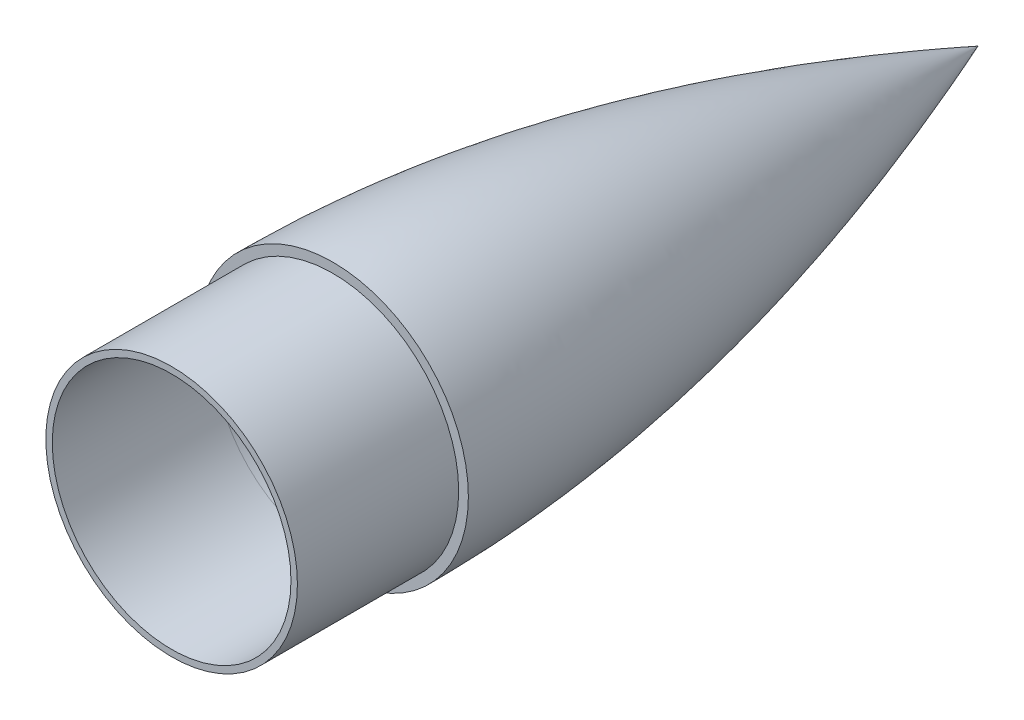
ISO-10303-21;
HEADER;
FILE_DESCRIPTION(('STEP AP214'),'2;1');
FILE_NAME('part.step','',(''),(''),'','','');
FILE_SCHEMA(('AUTOMOTIVE_DESIGN { 1 0 10303 214 1 1 1 1 }'));
ENDSEC;
DATA;
#1=APPLICATION_CONTEXT('core data for automotive mechanical design processes');
#2=APPLICATION_PROTOCOL_DEFINITION('international standard','automotive_design',2000,#1);
#3=PRODUCT_CONTEXT('',#1,'mechanical');
#4=PRODUCT('Part','Part','',(#3));
#5=PRODUCT_RELATED_PRODUCT_CATEGORY('part','',(#4));
#6=PRODUCT_DEFINITION_FORMATION('','',#4);
#7=PRODUCT_DEFINITION_CONTEXT('part definition',#1,'design');
#8=PRODUCT_DEFINITION('design','',#6,#7);
#9=PRODUCT_DEFINITION_SHAPE('','',#8);
#10=(LENGTH_UNIT() NAMED_UNIT(*) SI_UNIT(.MILLI.,.METRE.));
#11=(NAMED_UNIT(*) PLANE_ANGLE_UNIT() SI_UNIT($,.RADIAN.));
#12=(NAMED_UNIT(*) SI_UNIT($,.STERADIAN.) SOLID_ANGLE_UNIT());
#13=UNCERTAINTY_MEASURE_WITH_UNIT(LENGTH_MEASURE(1.E-05),#10,'distance_accuracy_value','');
#14=(GEOMETRIC_REPRESENTATION_CONTEXT(3) GLOBAL_UNCERTAINTY_ASSIGNED_CONTEXT((#13)) GLOBAL_UNIT_ASSIGNED_CONTEXT((#10,
#11,#12)) REPRESENTATION_CONTEXT('',''));
#15=CARTESIAN_POINT('',(0.,0.,0.));
#16=DIRECTION('',(0.,0.,1.));
#17=DIRECTION('',(1.,0.,0.));
#18=AXIS2_PLACEMENT_3D('',#15,#16,#17);
#19=CARTESIAN_POINT('',(0.,1.33475692265078E-08,-75.0000000026305));
#20=DIRECTION('',(0.,-1.77967594365095E-10,1.));
#21=DIRECTION('',(0.,-1.,-1.77967594365095E-10));
#22=AXIS2_PLACEMENT_3D('',#19,#20,#21);
#23=PLANE('',#22);
#24=CARTESIAN_POINT('',(8.00000000000001,18.0000000133476,-74.9999999994271));
#25=DIRECTION('',(0.,-1.77967577619409E-10,1.));
#26=DIRECTION('',(0.,-1.,-1.77967577619409E-10));
#27=AXIS2_PLACEMENT_3D('',#24,#25,#26);
#28=CIRCLE('',#27,1.49999999999999);
#29=CARTESIAN_POINT('',(8.00000000000001,16.5000000133476,-74.9999999996941));
#30=VERTEX_POINT('',#29);
#31=EDGE_CURVE('E286',#30,#30,#28,.T.);
#32=ORIENTED_EDGE('',*,*,#31,.F.);
#33=EDGE_LOOP('',(#32));
#34=FACE_BOUND('',#33,.T.);
#35=CARTESIAN_POINT('',(-8.00000000000001,18.0000000133476,-74.9999999994271));
#36=DIRECTION('',(0.,-1.77967577619409E-10,1.));
#37=DIRECTION('',(0.,-1.,-1.77967577619409E-10));
#38=AXIS2_PLACEMENT_3D('',#35,#36,#37);
#39=CIRCLE('',#38,1.49999999999999);
#40=CARTESIAN_POINT('',(-8.00000000000001,16.5000000133476,-74.9999999996941));
#41=VERTEX_POINT('',#40);
#42=EDGE_CURVE('E274',#41,#41,#39,.T.);
#43=ORIENTED_EDGE('',*,*,#42,.F.);
#44=EDGE_LOOP('',(#43));
#45=FACE_BOUND('',#44,.T.);
#46=DIRECTION('',(0.,1.,1.77967594365095E-10));
#47=VECTOR('',#46,1.);
#48=CARTESIAN_POINT('',(9.99999999999999,24.0000000133476,-74.9999999983593));
#49=LINE('',#48,#47);
#50=CARTESIAN_POINT('',(9.99999999999999,12.0000000133476,-75.0000000004949));
#51=VERTEX_POINT('',#50);
#52=CARTESIAN_POINT('',(9.99999999999999,24.0000000133476,-74.9999999983593));
#53=VERTEX_POINT('',#52);
#54=EDGE_CURVE('E228',#51,#53,#49,.T.);
#55=ORIENTED_EDGE('',*,*,#54,.T.);
#56=DIRECTION('',(-1.,0.,0.));
#57=VECTOR('',#56,1.);
#58=CARTESIAN_POINT('',(-10.,24.0000000133476,-74.9999999983593));
#59=LINE('',#58,#57);
#60=CARTESIAN_POINT('',(-10.,24.0000000133476,-74.9999999983593));
#61=VERTEX_POINT('',#60);
#62=EDGE_CURVE('E241',#53,#61,#59,.T.);
#63=ORIENTED_EDGE('',*,*,#62,.T.);
#64=DIRECTION('',(0.,-1.,-1.77967594365095E-10));
#65=VECTOR('',#64,1.);
#66=CARTESIAN_POINT('',(-10.,24.0000000133476,-74.9999999983593));
#67=LINE('',#66,#65);
#68=CARTESIAN_POINT('',(-10.,12.0000000133476,-75.0000000004949));
#69=VERTEX_POINT('',#68);
#70=EDGE_CURVE('E239',#61,#69,#67,.T.);
#71=ORIENTED_EDGE('',*,*,#70,.T.);
#72=DIRECTION('',(1.,0.,0.));
#73=VECTOR('',#72,1.);
#74=CARTESIAN_POINT('',(-10.,12.0000000133476,-75.0000000004949));
#75=LINE('',#74,#73);
#76=EDGE_CURVE('E225',#69,#51,#75,.T.);
#77=ORIENTED_EDGE('',*,*,#76,.T.);
#78=EDGE_LOOP('',(#55,#63,#71,#77));
#79=FACE_BOUND('',#78,.T.);
#80=CARTESIAN_POINT('',(-3.16059916331754,14.0729214157373,-75.000000003935));
#81=CARTESIAN_POINT('',(-2.94583485997053,13.8946913949933,-75.0000000047513));
#82=CARTESIAN_POINT('',(-2.71608729415504,13.7342308813803,-75.0000000014177));
#83=CARTESIAN_POINT('',(-2.23282532589333,13.4538458012483,-74.9999999990035));
#84=CARTESIAN_POINT('',(-1.97928754617758,13.3339616510058,-74.9999999999272));
#85=CARTESIAN_POINT('',(-1.45551397660316,13.1386458760582,-75.0000000006226));
#86=CARTESIAN_POINT('',(-1.18527406156808,13.0632252820489,-75.0000000003942));
#87=CARTESIAN_POINT('',(-0.635969600952839,12.9594203835441,-75.0000000002357));
#88=CARTESIAN_POINT('',(-0.356907421098613,12.931023576646,-75.0000000003056));
#89=CARTESIAN_POINT('',(0.198959915248841,12.9222319369116,-75.0000000003541));
#90=CARTESIAN_POINT('',(0.475757066685821,12.9413241248063,-75.0000000003336));
#91=CARTESIAN_POINT('',(1.02219234555366,13.0257985504851,-75.0000000003061));
#92=CARTESIAN_POINT('',(1.29183033795138,13.0911816607469,-75.000000000299));
#93=CARTESIAN_POINT('',(1.81596404804431,13.265972967002,-75.0000000002713));
#94=CARTESIAN_POINT('',(2.07048189230089,13.3753149170587,-75.0000000002506));
#95=CARTESIAN_POINT('',(2.55790343731592,13.6346081230102,-75.0000000002035));
#96=CARTESIAN_POINT('',(2.79080575824701,13.7845619689755,-75.0000000001772));
#97=CARTESIAN_POINT('',(3.23189080220136,14.1229538193692,-75.0000000001172));
#98=CARTESIAN_POINT('',(3.43968695533933,14.3118955444393,-75.0000000000835));
#99=CARTESIAN_POINT('',(3.82128824531745,14.7214462844263,-75.0000000000105));
#100=CARTESIAN_POINT('',(3.99509033189741,14.9420581380016,-74.9999999999713));
#101=CARTESIAN_POINT('',(4.30688209502843,15.4128480243792,-74.9999999998875));
#102=CARTESIAN_POINT('',(4.44419641406432,15.6634735077271,-74.9999999998429));
#103=CARTESIAN_POINT('',(4.6752796911522,16.1840580274191,-74.9999999997503));
#104=CARTESIAN_POINT('',(4.76904598925451,16.4540182435827,-74.9999999997022));
#105=CARTESIAN_POINT('',(4.91115126466318,17.0084813666178,-74.9999999996035));
#106=CARTESIAN_POINT('',(4.95903532689118,17.2931010061366,-74.9999999995529));
#107=CARTESIAN_POINT('',(5.0063368156295,17.8663455350747,-74.9999999994509));
#108=CARTESIAN_POINT('',(5.00575381584682,18.1549704597002,-74.9999999993995));
#109=CARTESIAN_POINT('',(4.95599419715498,18.7279511193188,-74.9999999992975));
#110=CARTESIAN_POINT('',(4.9068275552341,19.0123077186708,-74.9999999992469));
#111=CARTESIAN_POINT('',(4.76113006063322,19.5686222502568,-74.9999999991479));
#112=CARTESIAN_POINT('',(4.66460058189849,19.8405805419023,-74.9999999990995));
#113=CARTESIAN_POINT('',(4.42755776614476,20.3624297098799,-74.9999999990066));
#114=CARTESIAN_POINT('',(4.28734009745207,20.6124548621347,-74.9999999989622));
#115=CARTESIAN_POINT('',(3.96657519167026,21.085142291849,-74.999999998878));
#116=CARTESIAN_POINT('',(3.78602974204701,21.3078057813938,-74.9999999988384));
#117=CARTESIAN_POINT('',(3.39139438664012,21.7174316389508,-74.9999999987655));
#118=CARTESIAN_POINT('',(3.17760374930837,21.9046823342358,-74.9999999987322));
#119=CARTESIAN_POINT('',(2.7214209002871,22.2403118336855,-74.9999999986725));
#120=CARTESIAN_POINT('',(2.47902987924636,22.3886922552122,-74.999999998646));
#121=CARTESIAN_POINT('',(1.97446170631846,22.6412457248195,-74.9999999986011));
#122=CARTESIAN_POINT('',(1.71244380979336,22.7457369994757,-74.9999999985825));
#123=CARTESIAN_POINT('',(1.17453465466218,22.9090122526407,-74.9999999985534));
#124=CARTESIAN_POINT('',(0.89864380784829,22.9677975869918,-74.999999998543));
#125=CARTESIAN_POINT('',(0.342211091415948,23.0377614179116,-74.9999999985305));
#126=CARTESIAN_POINT('',(0.0616971506060282,23.049162202869,-74.9999999985285));
#127=CARTESIAN_POINT('',(-0.497251429175544,23.0246342929645,-74.9999999985329));
#128=CARTESIAN_POINT('',(-0.775686095378005,22.9887062190326,-74.9999999985393));
#129=CARTESIAN_POINT('',(-1.32217177477993,22.8706581270292,-74.9999999985603));
#130=CARTESIAN_POINT('',(-1.59023678154407,22.7886028586181,-74.9999999985749));
#131=CARTESIAN_POINT('',(-2.1088250436964,22.5807402617172,-74.9999999986119));
#132=CARTESIAN_POINT('',(-2.35934825162176,22.4549328148527,-74.9999999986343));
#133=CARTESIAN_POINT('',(-2.83631497025753,22.1629169095984,-74.9999999986862));
#134=CARTESIAN_POINT('',(-3.06270889743944,21.9966274812196,-74.9999999987158));
#135=CARTESIAN_POINT('',(-3.48454532560874,21.6285811324784,-74.9999999987813));
#136=CARTESIAN_POINT('',(-3.67998713712494,21.4268234222564,-74.9999999988172));
#137=CARTESIAN_POINT('',(-4.0354948217709,20.992476251901,-74.9999999988945));
#138=CARTESIAN_POINT('',(-4.1953713585264,20.7597318478866,-74.9999999989359));
#139=CARTESIAN_POINT('',(-4.47412320347626,20.2708691297937,-74.999999999023));
#140=CARTESIAN_POINT('',(-4.59299694245003,20.0147499216108,-74.9999999990687));
#141=CARTESIAN_POINT('',(-4.78736098787377,19.4843165449415,-74.9999999991628));
#142=CARTESIAN_POINT('',(-4.86251130186999,19.2098778099682,-74.9999999992112));
#143=CARTESIAN_POINT('',(-4.96609115111643,18.6523338123151,-74.9999999993116));
#144=CARTESIAN_POINT('',(-4.99452030554949,18.3692284790142,-74.9999999993636));
#145=CARTESIAN_POINT('',(-5.00408019364135,17.7998594302799,-74.9999999994605));
#146=CARTESIAN_POINT('',(-4.98481473165015,17.5135890573057,-74.9999999995053));
#147=CARTESIAN_POINT('',(-4.89879299061327,16.9481930707619,-74.9999999996226));
#148=CARTESIAN_POINT('',(-4.83202305929831,16.6690695350114,-74.9999999996951));
#149=CARTESIAN_POINT('',(-4.65231550735861,16.1241069992712,-74.9999999997295));
#150=CARTESIAN_POINT('',(-4.53908064828263,15.8583661303459,-74.9999999996907));
#151=CARTESIAN_POINT('',(-4.26962699272257,15.3499138527039,-75.0000000000161));
#152=CARTESIAN_POINT('',(-4.11345778449866,15.1071763079322,-75.0000000003799));
#153=CARTESIAN_POINT('',(-3.82386915113387,14.731219079126,-74.9999999997236));
#154=CARTESIAN_POINT('',(-3.7015187896537,14.5893344302878,-74.9999999991421));
#155=CARTESIAN_POINT('',(-3.44189116397088,14.3199435428915,-75.000000000974));
#156=CARTESIAN_POINT('',(-3.30461389220706,14.1924373116167,-75.0000000033875));
#157=CARTESIAN_POINT('',(-3.16059916331754,14.0729214157373,-75.000000003935));
#158=B_SPLINE_CURVE_WITH_KNOTS('',3,(#80,#81,#82,#83,#84,#85,#86,#87,#88,#89,#90,#91,#92,#93,
#94,#95,#96,#97,#98,#99,#100,#101,#102,#103,#104,#105,#106,#107,#108,#109,#110,#111,#112,#113,
#114,#115,#116,#117,#118,#119,#120,#121,#122,#123,#124,#125,#126,#127,#128,#129,#130,#131,#132,
#133,#134,#135,#136,#137,#138,#139,#140,#141,#142,#143,#144,#145,#146,#147,#148,#149,#150,#151,
#152,#153,#154,#155,#156,#157),.UNSPECIFIED.,.T.,.F.,(4,2,2,2,2,2,2,2,2,2,2,2,2,2,2,2,2,2,2,2,2,
2,2,2,2,2,2,2,2,2,2,2,2,2,2,2,2,2,4),(0.,0.836594176423545,1.67401921084498,2.51165190966958,
3.34906186795379,4.17746543447679,5.00588461492603,5.8330600201914,6.66028819194931,
7.49896093436856,8.33770889572821,9.19104308191093,10.0444293836094,10.9061919069444,
11.7679620099296,12.6295551792105,13.4911233560722,14.3469829104298,15.2028045376751,
16.0513260627218,16.8998122758332,17.7420354973217,18.5842337337544,19.4224765949432,
20.26070845893,21.0977666078274,21.934827021466,22.7735756384464,23.6123429362724,
24.455473993285,25.2986373142383,26.1482723291653,26.9979142693059,27.854637766508,
28.7116075762588,29.5741471127869,30.4356945896461,30.9966901582793,31.5576860110841),.UNSPECIFIED.);
#159=CARTESIAN_POINT('',(-5.,18.0000000133476,-74.9999999994271));
#160=VERTEX_POINT('',#159);
#161=CARTESIAN_POINT('',(5.,18.0000000133476,-74.9999999994271));
#162=VERTEX_POINT('',#161);
#163=EDGE_CURVE('E60',#160,#162,#158,.T.);
#164=ORIENTED_EDGE('',*,*,#163,.F.);
#165=DIRECTION('',(1.,0.,0.));
#166=VECTOR('',#165,1.);
#167=CARTESIAN_POINT('',(0.,18.0000000133476,-74.9999999994271));
#168=LINE('',#167,#166);
#169=EDGE_CURVE('E12',#160,#162,#168,.T.);
#170=ORIENTED_EDGE('',*,*,#169,.T.);
#171=EDGE_LOOP('',(#164,#170));
#172=FACE_BOUND('',#171,.T.);
#173=ADVANCED_FACE('F47',(#34,#45,#79,#172),#23,.T.);
#174=CARTESIAN_POINT('',(0.,29.5316801568768,-84.9999999973748));
#175=DIRECTION('',(0.,-1.77967629499344E-10,1.));
#176=DIRECTION('',(0.,-1.,-1.77967629499344E-10));
#177=AXIS2_PLACEMENT_3D('',#174,#175,#176);
#178=PLANE('',#177);
#179=CARTESIAN_POINT('',(0.,1.51272485083805E-08,-85.000000005261));
#180=DIRECTION('',(0.,1.77967629499344E-10,-1.));
#181=DIRECTION('',(0.,1.,1.77967629499344E-10));
#182=AXIS2_PLACEMENT_3D('',#179,#180,#181);
#183=CIRCLE('',#182,29.5316801417495);
#184=CARTESIAN_POINT('',(0.,29.5316801568768,-85.0000000000053));
#185=VERTEX_POINT('',#184);
#186=EDGE_CURVE('E209',#185,#185,#183,.T.);
#187=ORIENTED_EDGE('',*,*,#186,.F.);
#188=EDGE_LOOP('',(#187));
#189=FACE_BOUND('',#188,.T.);
#190=DIRECTION('',(-1.,0.,0.));
#191=VECTOR('',#190,1.);
#192=CARTESIAN_POINT('',(-10.,24.0000000151272,-84.9999999983593));
#193=LINE('',#192,#191);
#194=CARTESIAN_POINT('',(9.99999999999999,24.0000000151273,-84.9999999983593));
#195=VERTEX_POINT('',#194);
#196=CARTESIAN_POINT('',(-10.,24.0000000151272,-84.9999999983593));
#197=VERTEX_POINT('',#196);
#198=EDGE_CURVE('E232',#195,#197,#193,.T.);
#199=ORIENTED_EDGE('',*,*,#198,.F.);
#200=DIRECTION('',(0.,1.,1.77967594365095E-10));
#201=VECTOR('',#200,1.);
#202=CARTESIAN_POINT('',(9.99999999999999,24.0000000151273,-84.9999999983593));
#203=LINE('',#202,#201);
#204=CARTESIAN_POINT('',(9.99999999999999,12.0000000151272,-85.0000000004949));
#205=VERTEX_POINT('',#204);
#206=EDGE_CURVE('E234',#205,#195,#203,.T.);
#207=ORIENTED_EDGE('',*,*,#206,.F.);
#208=DIRECTION('',(1.,0.,0.));
#209=VECTOR('',#208,1.);
#210=CARTESIAN_POINT('',(-10.,12.0000000151272,-85.0000000004949));
#211=LINE('',#210,#209);
#212=CARTESIAN_POINT('',(-10.,12.0000000151272,-85.0000000004949));
#213=VERTEX_POINT('',#212);
#214=EDGE_CURVE('E226',#213,#205,#211,.T.);
#215=ORIENTED_EDGE('',*,*,#214,.F.);
#216=DIRECTION('',(0.,-1.,-1.77967594365095E-10));
#217=VECTOR('',#216,1.);
#218=CARTESIAN_POINT('',(-10.,24.0000000151272,-84.9999999983593));
#219=LINE('',#218,#217);
#220=EDGE_CURVE('E229',#197,#213,#219,.T.);
#221=ORIENTED_EDGE('',*,*,#220,.F.);
#222=EDGE_LOOP('',(#199,#207,#215,#221));
#223=FACE_BOUND('',#222,.T.);
#224=DIRECTION('',(1.,0.,0.));
#225=VECTOR('',#224,1.);
#226=CARTESIAN_POINT('',(-10.,-23.9999999848727,-85.0000000069017));
#227=LINE('',#226,#225);
#228=CARTESIAN_POINT('',(-10.,-23.9999999848727,-85.0000000069017));
#229=VERTEX_POINT('',#228);
#230=CARTESIAN_POINT('',(9.99999999999999,-23.9999999848728,-85.0000000069017));
#231=VERTEX_POINT('',#230);
#232=EDGE_CURVE('E261',#229,#231,#227,.T.);
#233=ORIENTED_EDGE('',*,*,#232,.F.);
#234=DIRECTION('',(0.,-1.,-1.77967594365095E-10));
#235=VECTOR('',#234,1.);
#236=CARTESIAN_POINT('',(-10.,-23.9999999848727,-85.0000000069017));
#237=LINE('',#236,#235);
#238=CARTESIAN_POINT('',(-10.,-11.9999999848727,-85.0000000047661));
#239=VERTEX_POINT('',#238);
#240=EDGE_CURVE('E263',#239,#229,#237,.T.);
#241=ORIENTED_EDGE('',*,*,#240,.F.);
#242=DIRECTION('',(-1.,0.,0.));
#243=VECTOR('',#242,1.);
#244=CARTESIAN_POINT('',(-10.,-11.9999999848727,-85.0000000047661));
#245=LINE('',#244,#243);
#246=CARTESIAN_POINT('',(9.99999999999999,-11.9999999848728,-85.0000000047661));
#247=VERTEX_POINT('',#246);
#248=EDGE_CURVE('E255',#247,#239,#245,.T.);
#249=ORIENTED_EDGE('',*,*,#248,.F.);
#250=DIRECTION('',(0.,1.,1.77967594365095E-10));
#251=VECTOR('',#250,1.);
#252=CARTESIAN_POINT('',(9.99999999999999,-23.9999999848728,-85.0000000069017));
#253=LINE('',#252,#251);
#254=EDGE_CURVE('E258',#231,#247,#253,.T.);
#255=ORIENTED_EDGE('',*,*,#254,.F.);
#256=EDGE_LOOP('',(#233,#241,#249,#255));
#257=FACE_BOUND('',#256,.T.);
#258=ADVANCED_FACE('F170',(#189,#223,#257),#178,.T.);
#259=CARTESIAN_POINT('',(0.,37.,0.));
#260=CARTESIAN_POINT('',(0.,37.,-91.0054943396276));
#261=CARTESIAN_POINT('',(0.,0.,-198.));
#262=B_SPLINE_CURVE_WITH_KNOTS('',2,(#259,#260,#261),.UNSPECIFIED.,.F.,.F.,(3,3),(0.,1.),.UNSPECIFIED.);
#263=CARTESIAN_POINT('',(0.,0.,198.));
#264=DIRECTION('',(0.,0.,1.));
#265=AXIS1_PLACEMENT('',#263,#264);
#266=SURFACE_OF_REVOLUTION('',#262,#265);
#267=ORIENTED_EDGE('',*,*,#186,.T.);
#268=EDGE_LOOP('',(#267));
#269=FACE_BOUND('',#268,.T.);
#270=CARTESIAN_POINT('',(0.,0.,0.));
#271=DIRECTION('',(0.,0.,1.));
#272=DIRECTION('',(1.,0.,0.));
#273=AXIS2_PLACEMENT_3D('',#270,#271,#272);
#274=CIRCLE('',#273,37.);
#275=CARTESIAN_POINT('',(37.,0.,0.));
#276=VERTEX_POINT('',#275);
#277=EDGE_CURVE('E567',#276,#276,#274,.T.);
#278=ORIENTED_EDGE('',*,*,#277,.T.);
#279=EDGE_LOOP('',(#278));
#280=FACE_BOUND('',#279,.T.);
#281=ADVANCED_FACE('F189',(#269,#280),#266,.T.);
#282=CARTESIAN_POINT('',(9.99999999999999,24.0000000133476,-74.9999999983593));
#283=DIRECTION('',(-1.,0.,0.));
#284=DIRECTION('',(0.,-1.,0.));
#285=AXIS2_PLACEMENT_3D('',#282,#283,#284);
#286=PLANE('',#285);
#287=ORIENTED_EDGE('',*,*,#206,.T.);
#288=DIRECTION('',(0.,1.77967629499344E-10,-1.));
#289=VECTOR('',#288,1.);
#290=CARTESIAN_POINT('',(9.99999999999999,24.0000000133476,-74.9999999983593));
#291=LINE('',#290,#289);
#292=EDGE_CURVE('E215',#53,#195,#291,.T.);
#293=ORIENTED_EDGE('',*,*,#292,.F.);
#294=ORIENTED_EDGE('',*,*,#54,.F.);
#295=DIRECTION('',(0.,1.77967629499344E-10,-1.));
#296=VECTOR('',#295,1.);
#297=CARTESIAN_POINT('',(9.99999999999999,12.0000000133476,-75.0000000004949));
#298=LINE('',#297,#296);
#299=EDGE_CURVE('E222',#51,#205,#298,.T.);
#300=ORIENTED_EDGE('',*,*,#299,.T.);
#301=EDGE_LOOP('',(#287,#293,#294,#300));
#302=FACE_BOUND('',#301,.T.);
#303=ADVANCED_FACE('F185',(#302),#286,.F.);
#304=CARTESIAN_POINT('',(-10.,24.0000000133476,-74.9999999983593));
#305=DIRECTION('',(0.,-1.,-1.77967629499344E-10));
#306=DIRECTION('',(0.,1.77967629499344E-10,-1.));
#307=AXIS2_PLACEMENT_3D('',#304,#305,#306);
#308=PLANE('',#307);
#309=ORIENTED_EDGE('',*,*,#198,.T.);
#310=DIRECTION('',(0.,1.77967629499344E-10,-1.));
#311=VECTOR('',#310,1.);
#312=CARTESIAN_POINT('',(-10.,24.0000000133476,-74.9999999983593));
#313=LINE('',#312,#311);
#314=EDGE_CURVE('E217',#61,#197,#313,.T.);
#315=ORIENTED_EDGE('',*,*,#314,.F.);
#316=ORIENTED_EDGE('',*,*,#62,.F.);
#317=ORIENTED_EDGE('',*,*,#292,.T.);
#318=EDGE_LOOP('',(#309,#315,#316,#317));
#319=FACE_BOUND('',#318,.T.);
#320=ADVANCED_FACE('F181',(#319),#308,.F.);
#321=CARTESIAN_POINT('',(-10.,24.0000000133476,-74.9999999983593));
#322=DIRECTION('',(1.,0.,0.));
#323=DIRECTION('',(0.,0.,-1.));
#324=AXIS2_PLACEMENT_3D('',#321,#322,#323);
#325=PLANE('',#324);
#326=ORIENTED_EDGE('',*,*,#220,.T.);
#327=DIRECTION('',(0.,1.77967629499344E-10,-1.));
#328=VECTOR('',#327,1.);
#329=CARTESIAN_POINT('',(-10.,12.0000000133476,-75.0000000004949));
#330=LINE('',#329,#328);
#331=EDGE_CURVE('E220',#69,#213,#330,.T.);
#332=ORIENTED_EDGE('',*,*,#331,.F.);
#333=ORIENTED_EDGE('',*,*,#70,.F.);
#334=ORIENTED_EDGE('',*,*,#314,.T.);
#335=EDGE_LOOP('',(#326,#332,#333,#334));
#336=FACE_BOUND('',#335,.T.);
#337=ADVANCED_FACE('F177',(#336),#325,.F.);
#338=CARTESIAN_POINT('',(-10.,12.0000000133476,-75.0000000004949));
#339=DIRECTION('',(0.,1.,1.77967629499344E-10));
#340=DIRECTION('',(0.,-1.77967629499344E-10,1.));
#341=AXIS2_PLACEMENT_3D('',#338,#339,#340);
#342=PLANE('',#341);
#343=ORIENTED_EDGE('',*,*,#214,.T.);
#344=ORIENTED_EDGE('',*,*,#299,.F.);
#345=ORIENTED_EDGE('',*,*,#76,.F.);
#346=ORIENTED_EDGE('',*,*,#331,.T.);
#347=EDGE_LOOP('',(#343,#344,#345,#346));
#348=FACE_BOUND('',#347,.T.);
#349=ADVANCED_FACE('F174',(#348),#342,.F.);
#350=CARTESIAN_POINT('',(-10.,-23.9999999866524,-75.0000000069017));
#351=DIRECTION('',(1.,0.,0.));
#352=DIRECTION('',(0.,0.,-1.));
#353=AXIS2_PLACEMENT_3D('',#350,#351,#352);
#354=PLANE('',#353);
#355=ORIENTED_EDGE('',*,*,#240,.T.);
#356=DIRECTION('',(0.,1.77967629499344E-10,-1.));
#357=VECTOR('',#356,1.);
#358=CARTESIAN_POINT('',(-10.,-23.9999999866524,-75.0000000069017));
#359=LINE('',#358,#357);
#360=CARTESIAN_POINT('',(-10.,-23.9999999866524,-75.0000000069017));
#361=VERTEX_POINT('',#360);
#362=EDGE_CURVE('E237',#361,#229,#359,.T.);
#363=ORIENTED_EDGE('',*,*,#362,.F.);
#364=DIRECTION('',(0.,-1.,-1.77967594365095E-10));
#365=VECTOR('',#364,1.);
#366=CARTESIAN_POINT('',(-10.,-23.9999999866524,-75.0000000069017));
#367=LINE('',#366,#365);
#368=CARTESIAN_POINT('',(-10.,-11.9999999866524,-75.0000000047661));
#369=VERTEX_POINT('',#368);
#370=EDGE_CURVE('E257',#369,#361,#367,.T.);
#371=ORIENTED_EDGE('',*,*,#370,.F.);
#372=DIRECTION('',(0.,1.77967629499344E-10,-1.));
#373=VECTOR('',#372,1.);
#374=CARTESIAN_POINT('',(-10.,-11.9999999866524,-75.0000000047661));
#375=LINE('',#374,#373);
#376=EDGE_CURVE('E251',#369,#239,#375,.T.);
#377=ORIENTED_EDGE('',*,*,#376,.T.);
#378=EDGE_LOOP('',(#355,#363,#371,#377));
#379=FACE_BOUND('',#378,.T.);
#380=ADVANCED_FACE('F172',(#379),#354,.F.);
#381=CARTESIAN_POINT('',(-10.,-23.9999999866524,-75.0000000069017));
#382=DIRECTION('',(0.,1.,1.77967629499344E-10));
#383=DIRECTION('',(0.,-1.77967629499344E-10,1.));
#384=AXIS2_PLACEMENT_3D('',#381,#382,#383);
#385=PLANE('',#384);
#386=ORIENTED_EDGE('',*,*,#232,.T.);
#387=DIRECTION('',(0.,1.77967629499344E-10,-1.));
#388=VECTOR('',#387,1.);
#389=CARTESIAN_POINT('',(9.99999999999999,-23.9999999866524,-75.0000000069017));
#390=LINE('',#389,#388);
#391=CARTESIAN_POINT('',(9.99999999999999,-23.9999999866524,-75.0000000069017));
#392=VERTEX_POINT('',#391);
#393=EDGE_CURVE('E246',#392,#231,#390,.T.);
#394=ORIENTED_EDGE('',*,*,#393,.F.);
#395=DIRECTION('',(1.,0.,0.));
#396=VECTOR('',#395,1.);
#397=CARTESIAN_POINT('',(-10.,-23.9999999866524,-75.0000000069017));
#398=LINE('',#397,#396);
#399=EDGE_CURVE('E270',#361,#392,#398,.T.);
#400=ORIENTED_EDGE('',*,*,#399,.F.);
#401=ORIENTED_EDGE('',*,*,#362,.T.);
#402=EDGE_LOOP('',(#386,#394,#400,#401));
#403=FACE_BOUND('',#402,.T.);
#404=ADVANCED_FACE('F356',(#403),#385,.F.);
#405=CARTESIAN_POINT('',(9.99999999999999,-23.9999999866524,-75.0000000069017));
#406=DIRECTION('',(-1.,0.,0.));
#407=DIRECTION('',(0.,-1.,0.));
#408=AXIS2_PLACEMENT_3D('',#405,#406,#407);
#409=PLANE('',#408);
#410=ORIENTED_EDGE('',*,*,#254,.T.);
#411=DIRECTION('',(0.,1.77967629499344E-10,-1.));
#412=VECTOR('',#411,1.);
#413=CARTESIAN_POINT('',(9.99999999999999,-11.9999999866524,-75.0000000047661));
#414=LINE('',#413,#412);
#415=CARTESIAN_POINT('',(9.99999999999999,-11.9999999866524,-75.0000000047661));
#416=VERTEX_POINT('',#415);
#417=EDGE_CURVE('E249',#416,#247,#414,.T.);
#418=ORIENTED_EDGE('',*,*,#417,.F.);
#419=DIRECTION('',(0.,1.,1.77967594365095E-10));
#420=VECTOR('',#419,1.);
#421=CARTESIAN_POINT('',(9.99999999999999,-23.9999999866524,-75.0000000069017));
#422=LINE('',#421,#420);
#423=EDGE_CURVE('E268',#392,#416,#422,.T.);
#424=ORIENTED_EDGE('',*,*,#423,.F.);
#425=ORIENTED_EDGE('',*,*,#393,.T.);
#426=EDGE_LOOP('',(#410,#418,#424,#425));
#427=FACE_BOUND('',#426,.T.);
#428=ADVANCED_FACE('F360',(#427),#409,.F.);
#429=CARTESIAN_POINT('',(-10.,-11.9999999866524,-75.0000000047661));
#430=DIRECTION('',(0.,-1.,-1.77967629499344E-10));
#431=DIRECTION('',(0.,1.77967629499344E-10,-1.));
#432=AXIS2_PLACEMENT_3D('',#429,#430,#431);
#433=PLANE('',#432);
#434=ORIENTED_EDGE('',*,*,#248,.T.);
#435=ORIENTED_EDGE('',*,*,#376,.F.);
#436=DIRECTION('',(-1.,0.,0.));
#437=VECTOR('',#436,1.);
#438=CARTESIAN_POINT('',(-10.,-11.9999999866524,-75.0000000047661));
#439=LINE('',#438,#437);
#440=EDGE_CURVE('E254',#416,#369,#439,.T.);
#441=ORIENTED_EDGE('',*,*,#440,.F.);
#442=ORIENTED_EDGE('',*,*,#417,.T.);
#443=EDGE_LOOP('',(#434,#435,#441,#442));
#444=FACE_BOUND('',#443,.T.);
#445=ADVANCED_FACE('F307',(#444),#433,.F.);
#446=CARTESIAN_POINT('',(0.,1.33475692265078E-08,-75.0000000026305));
#447=DIRECTION('',(0.,1.77967594365095E-10,-1.));
#448=DIRECTION('',(0.,1.,1.77967594365095E-10));
#449=AXIS2_PLACEMENT_3D('',#446,#447,#448);
#450=PLANE('',#449);
#451=CARTESIAN_POINT('',(-3.63152117006369,-21.4676073154887,-74.9999998929923));
#452=CARTESIAN_POINT('',(-3.72860788863273,-21.364253092452,-74.9999999011125));
#453=CARTESIAN_POINT('',(-3.82129852519105,-21.2567890450502,-74.9999999781884));
#454=CARTESIAN_POINT('',(-3.99729238199996,-21.0343728785555,-75.0000000346071));
#455=CARTESIAN_POINT('',(-4.08059292842954,-20.9194186412671,-75.000000013922));
#456=CARTESIAN_POINT('',(-4.23726897119449,-20.6827778953921,-74.9999999987356));
#457=CARTESIAN_POINT('',(-4.31063481350953,-20.5610849980024,-75.0000000042595));
#458=CARTESIAN_POINT('',(-4.44687232499543,-20.3119019364151,-75.0000000082763));
#459=CARTESIAN_POINT('',(-4.50974009989123,-20.1844096431381,-75.0000000067666));
#460=CARTESIAN_POINT('',(-4.62445451002191,-19.9247465762128,-75.0000000056332));
#461=CARTESIAN_POINT('',(-4.67631448804864,-19.7925816957426,-75.0000000060074));
#462=CARTESIAN_POINT('',(-4.76878536660053,-19.5243197307186,-75.0000000062508));
#463=CARTESIAN_POINT('',(-4.80939212044644,-19.3882212170135,-75.00000000612));
#464=CARTESIAN_POINT('',(-4.87904813778364,-19.1131891775566,-75.000000005993));
#465=CARTESIAN_POINT('',(-4.90810459367707,-18.9742574728898,-75.0000000059969));
#466=CARTESIAN_POINT('',(-4.95452512883346,-18.6944020616817,-75.000000005968));
#467=CARTESIAN_POINT('',(-4.9718848651306,-18.5534776350539,-75.0000000059352));
#468=CARTESIAN_POINT('',(-4.99486436709517,-18.2698217806886,-75.0000000058791));
#469=CARTESIAN_POINT('',(-5.00041292560479,-18.1270845828625,-75.0000000058558));
#470=CARTESIAN_POINT('',(-4.99953905530339,-17.8415947775882,-75.0000000058065));
#471=CARTESIAN_POINT('',(-4.99311220224998,-17.6988421839356,-75.0000000057805));
#472=CARTESIAN_POINT('',(-4.96834329630271,-17.4144158238018,-75.0000000057295));
#473=CARTESIAN_POINT('',(-4.95000464630285,-17.2727417609027,-75.0000000057044));
#474=CARTESIAN_POINT('',(-4.90154606549929,-16.9913695533426,-75.0000000056545));
#475=CARTESIAN_POINT('',(-4.87142176987074,-16.8516721606275,-75.0000000056296));
#476=CARTESIAN_POINT('',(-4.79937550277473,-16.5743897630082,-75.0000000055802));
#477=CARTESIAN_POINT('',(-4.75737869774763,-16.4368241919516,-75.0000000055557));
#478=CARTESIAN_POINT('',(-4.66195058009028,-16.1656634233917,-75.0000000055075));
#479=CARTESIAN_POINT('',(-4.60851502507761,-16.0320697199603,-75.0000000054837));
#480=CARTESIAN_POINT('',(-4.4905998639501,-15.7698914685812,-75.000000005437));
#481=CARTESIAN_POINT('',(-4.42612403498072,-15.6413052258665,-75.0000000054142));
#482=CARTESIAN_POINT('',(-4.28656864660728,-15.3900053266177,-75.0000000053694));
#483=CARTESIAN_POINT('',(-4.21148518611147,-15.2672938529338,-75.0000000053476));
#484=CARTESIAN_POINT('',(-3.97098071381781,-14.9092548539834,-75.0000000052839));
#485=CARTESIAN_POINT('',(-3.79026337008376,-14.6839289636597,-75.0000000052438));
#486=CARTESIAN_POINT('',(-3.39333405683519,-14.2672877671443,-75.0000000051696));
#487=CARTESIAN_POINT('',(-3.1771234704358,-14.0759711362708,-75.0000000051356));
#488=CARTESIAN_POINT('',(-2.71731331376762,-13.7346894227069,-75.0000000050748));
#489=CARTESIAN_POINT('',(-2.47399052728769,-13.5843522725829,-75.0000000050481));
#490=CARTESIAN_POINT('',(-1.96522084187052,-13.3275167572764,-75.0000000050024));
#491=CARTESIAN_POINT('',(-1.69977643596994,-13.2210134601691,-75.0000000049834));
#492=CARTESIAN_POINT('',(-1.15927133097663,-13.0568361372693,-75.0000000049542));
#493=CARTESIAN_POINT('',(-0.884460485567883,-12.9983395571463,-75.0000000049438));
#494=CARTESIAN_POINT('',(-0.328898533589199,-12.9290436758674,-75.0000000049315));
#495=CARTESIAN_POINT('',(-0.0481480175335551,-12.9182396553622,-75.0000000049295));
#496=CARTESIAN_POINT('',(0.507175809448665,-12.944500071037,-75.0000000049342));
#497=CARTESIAN_POINT('',(0.781780756385503,-12.9809017110449,-75.0000000049407));
#498=CARTESIAN_POINT('',(1.32099114298528,-13.099222252383,-75.0000000049617));
#499=CARTESIAN_POINT('',(1.58559657691618,-13.1811411798049,-75.0000000049763));
#500=CARTESIAN_POINT('',(2.09791202652015,-13.3880496281498,-75.0000000050131));
#501=CARTESIAN_POINT('',(2.34559163271522,-13.5131143488951,-75.0000000050354));
#502=CARTESIAN_POINT('',(2.81688204886748,-13.8024352902584,-75.0000000050869));
#503=CARTESIAN_POINT('',(3.04049102825329,-13.9666944885655,-75.0000000051161));
#504=CARTESIAN_POINT('',(3.46104298783072,-14.33242872237,-75.0000000051812));
#505=CARTESIAN_POINT('',(3.65751673669384,-14.5344432288344,-75.0000000052172));
#506=CARTESIAN_POINT('',(4.01444350479585,-14.9681167772534,-75.0000000052943));
#507=CARTESIAN_POINT('',(4.1748933279149,-15.1997784467072,-75.0000000053356));
#508=CARTESIAN_POINT('',(4.45791777271853,-15.6903468818175,-75.0000000054229));
#509=CARTESIAN_POINT('',(4.57981953358743,-15.9496420426816,-75.000000005469));
#510=CARTESIAN_POINT('',(4.7787574817928,-16.4849116263576,-75.0000000055643));
#511=CARTESIAN_POINT('',(4.85579138387513,-16.7608868979473,-75.0000000056134));
#512=CARTESIAN_POINT('',(4.96325493592893,-17.3240367380437,-75.0000000057136));
#513=CARTESIAN_POINT('',(4.99331229093014,-17.611282459172,-75.0000000057647));
#514=CARTESIAN_POINT('',(5.0046908865309,-18.1867443885721,-75.0000000058672));
#515=CARTESIAN_POINT('',(4.98601208507597,-18.474960597681,-75.0000000059185));
#516=CARTESIAN_POINT('',(4.90036214879121,-19.0436158327207,-75.0000000060197));
#517=CARTESIAN_POINT('',(4.83347572004522,-19.3240676052744,-75.0000000060696));
#518=CARTESIAN_POINT('',(4.65321175516652,-19.8696252435368,-75.0000000061666));
#519=CARTESIAN_POINT('',(4.53983583394758,-20.1347316419355,-75.0000000062138));
#520=CARTESIAN_POINT('',(4.27070972936957,-20.6399572566542,-75.0000000063038));
#521=CARTESIAN_POINT('',(4.11527446583894,-20.8802445340682,-75.0000000063465));
#522=CARTESIAN_POINT('',(3.76581372675434,-21.3311112092605,-75.0000000064268));
#523=CARTESIAN_POINT('',(3.57178991047031,-21.5416918837282,-75.0000000064642));
#524=CARTESIAN_POINT('',(3.25716787714832,-21.829553720649,-75.0000000065154));
#525=CARTESIAN_POINT('',(3.14881260103623,-21.9205500549856,-75.0000000065316));
#526=CARTESIAN_POINT('',(2.92479631186977,-22.0930301179072,-75.0000000065623));
#527=CARTESIAN_POINT('',(2.80913810615997,-22.1745174679767,-75.0000000065768));
#528=CARTESIAN_POINT('',(2.57129001274454,-22.3274036436937,-75.0000000066041));
#529=CARTESIAN_POINT('',(2.44909787015697,-22.3987989551718,-75.0000000066168));
#530=CARTESIAN_POINT('',(2.19913281493062,-22.5309238999144,-75.0000000066403));
#531=CARTESIAN_POINT('',(2.0713620301042,-22.5916575561417,-75.0000000066511));
#532=CARTESIAN_POINT('',(1.81197506519808,-22.7016740679566,-75.0000000066707));
#533=CARTESIAN_POINT('',(1.68038971080822,-22.7510296228679,-75.0000000066795));
#534=CARTESIAN_POINT('',(1.41356633995503,-22.8384197647033,-75.000000006695));
#535=CARTESIAN_POINT('',(1.27832972298475,-22.8764586238571,-75.0000000067018));
#536=CARTESIAN_POINT('',(1.00508074049984,-22.9409695873554,-75.0000000067133));
#537=CARTESIAN_POINT('',(0.867067525048785,-22.9674380917984,-75.000000006718));
#538=CARTESIAN_POINT('',(0.589347296903327,-23.0085878291871,-75.0000000067252));
#539=CARTESIAN_POINT('',(0.449640935307796,-23.0232734558284,-75.0000000067277));
#540=CARTESIAN_POINT('',(0.170026885346668,-23.0407316061871,-75.0000000067312));
#541=CARTESIAN_POINT('',(0.0301220484591717,-23.0435498291377,-75.0000000067322));
#542=CARTESIAN_POINT('',(-0.249374912710234,-23.0373788712741,-75.0000000067298));
#543=CARTESIAN_POINT('',(-0.388967134020918,-23.0283940858357,-75.0000000067264));
#544=CARTESIAN_POINT('',(-0.666982539918229,-22.9986815089175,-75.0000000067259));
#545=CARTESIAN_POINT('',(-0.805404957078433,-22.9779465367755,-75.0000000067288));
#546=CARTESIAN_POINT('',(-1.07995821715279,-22.9248902751477,-75.0000000067014));
#547=CARTESIAN_POINT('',(-1.21608988270482,-22.8925732420851,-75.0000000066711));
#548=CARTESIAN_POINT('',(-1.48515838500976,-22.8165850526622,-75.0000000067247));
#549=CARTESIAN_POINT('',(-1.61809496197217,-22.7729129764199,-75.0000000068086));
#550=CARTESIAN_POINT('',(-1.87977245097307,-22.6745535057914,-75.0000000065406));
#551=CARTESIAN_POINT('',(-2.00851487067802,-22.6198701215335,-75.0000000061888));
#552=CARTESIAN_POINT('',(-2.26083488228185,-22.4999291092308,-75.0000000071017));
#553=CARTESIAN_POINT('',(-2.38441704494155,-22.4346811000675,-75.000000008365));
#554=CARTESIAN_POINT('',(-2.62563487300075,-22.2940739991507,-75.0000000048567));
#555=CARTESIAN_POINT('',(-2.74327211622633,-22.2187176098467,-75.0000000000867));
#556=CARTESIAN_POINT('',(-2.99755756671077,-22.0403650132368,-75.0000000145129));
#557=CARTESIAN_POINT('',(-3.13252842296574,-21.9349646592072,-75.0000000393426));
#558=CARTESIAN_POINT('',(-3.39097087970121,-21.7109041808095,-74.999999973686));
#559=CARTESIAN_POINT('',(-3.51444250263628,-21.5922440823347,-74.9999998832001));
#560=CARTESIAN_POINT('',(-3.63152117006369,-21.4676073154887,-74.9999998929923));
#561=B_SPLINE_CURVE_WITH_KNOTS('',3,(#451,#452,#453,#454,#455,#456,#457,#458,#459,#460,#461,
#462,#463,#464,#465,#466,#467,#468,#469,#470,#471,#472,#473,#474,#475,#476,#477,#478,#479,#480,
#481,#482,#483,#484,#485,#486,#487,#488,#489,#490,#491,#492,#493,#494,#495,#496,#497,#498,#499,
#500,#501,#502,#503,#504,#505,#506,#507,#508,#509,#510,#511,#512,#513,#514,#515,#516,#517,#518,
#519,#520,#521,#522,#523,#524,#525,#526,#527,#528,#529,#530,#531,#532,#533,#534,#535,#536,#537,
#538,#539,#540,#541,#542,#543,#544,#545,#546,#547,#548,#549,#550,#551,#552,#553,#554,#555,#556,
#557,#558,#559,#560),.UNSPECIFIED.,.T.,.F.,(4,2,2,2,2,2,2,2,2,2,2,2,2,2,2,2,2,2,2,2,2,2,2,2,2,2,
2,2,2,2,2,2,2,2,2,2,2,2,2,2,2,2,2,2,2,2,2,2,2,2,2,2,2,2,4),(0.,0.42525570352379,
0.850632194024783,1.27641912119243,1.70236364551831,2.12778888696648,2.55337068473953,
2.97868705485676,3.40416125709556,3.8321933746856,4.26038365747127,4.688451671073,
5.11667837036488,5.54766682395777,5.97881539954673,6.40981676240152,6.84097704612239,
7.70299293271174,8.5649752358858,9.41884879518412,10.2726262554213,11.1114501401116,
11.9501910183157,12.7772820016972,13.6043734591875,14.4329138183838,15.2615171436317,
16.1030177160294,16.9445929186828,17.8001366902284,18.6557240333655,19.5180582372926,
20.3803931853286,21.2412165988777,22.1020101123836,22.9565287110606,23.8110105742164,
24.2350835029231,24.6589943932163,25.0830525326757,25.5069503167163,25.9280595456336,
26.3490095969073,26.7700905259326,27.1910143657908,27.6103158130358,28.0294611589704,
28.4488629256688,28.8681107194248,29.2873924873965,29.7065218354523,30.1252716985086,
30.5439098321611,31.0567345423005,31.569558251025),.UNSPECIFIED.);
#562=CARTESIAN_POINT('',(-5.,-18.0000000080772,-75.0000000058339));
#563=VERTEX_POINT('',#562);
#564=CARTESIAN_POINT('',(5.,-18.0000000080772,-75.0000000058339));
#565=VERTEX_POINT('',#564);
#566=EDGE_CURVE('E124',#563,#565,#561,.T.);
#567=ORIENTED_EDGE('',*,*,#566,.T.);
#568=DIRECTION('',(-1.,0.,0.));
#569=VECTOR('',#568,1.);
#570=CARTESIAN_POINT('',(0.,-18.0000000080772,-75.0000000058339));
#571=LINE('',#570,#569);
#572=EDGE_CURVE('E55',#565,#563,#571,.T.);
#573=ORIENTED_EDGE('',*,*,#572,.T.);
#574=EDGE_LOOP('',(#567,#573));
#575=FACE_BOUND('',#574,.T.);
#576=CARTESIAN_POINT('',(-8.00000000000001,-17.9999999866524,-75.0000000058339));
#577=DIRECTION('',(0.,-1.77967577619409E-10,1.));
#578=DIRECTION('',(0.,-1.,-1.77967577619409E-10));
#579=AXIS2_PLACEMENT_3D('',#576,#577,#578);
#580=CIRCLE('',#579,1.49999999999999);
#581=CARTESIAN_POINT('',(-8.00000000000001,-19.4999999866524,-75.0000000061009));
#582=VERTEX_POINT('',#581);
#583=EDGE_CURVE('E280',#582,#582,#580,.T.);
#584=ORIENTED_EDGE('',*,*,#583,.F.);
#585=EDGE_LOOP('',(#584));
#586=FACE_BOUND('',#585,.T.);
#587=CARTESIAN_POINT('',(8.00000000000001,-17.9999999866524,-75.0000000058339));
#588=DIRECTION('',(0.,-1.77967577619409E-10,1.));
#589=DIRECTION('',(0.,-1.,-1.77967577619409E-10));
#590=AXIS2_PLACEMENT_3D('',#587,#588,#589);
#591=CIRCLE('',#590,1.49999999999999);
#592=CARTESIAN_POINT('',(8.00000000000001,-19.4999999866524,-75.0000000061009));
#593=VERTEX_POINT('',#592);
#594=EDGE_CURVE('E162',#593,#593,#591,.T.);
#595=ORIENTED_EDGE('',*,*,#594,.F.);
#596=EDGE_LOOP('',(#595));
#597=FACE_BOUND('',#596,.T.);
#598=ORIENTED_EDGE('',*,*,#370,.T.);
#599=ORIENTED_EDGE('',*,*,#399,.T.);
#600=ORIENTED_EDGE('',*,*,#423,.T.);
#601=ORIENTED_EDGE('',*,*,#440,.T.);
#602=EDGE_LOOP('',(#598,#599,#600,#601));
#603=FACE_BOUND('',#602,.T.);
#604=ADVANCED_FACE('F134',(#575,#586,#597,#603),#450,.F.);
#605=CARTESIAN_POINT('',(8.00000000000001,-17.9999999839829,-90.0000000058339));
#606=DIRECTION('',(0.,-1.77967594365095E-10,1.));
#607=DIRECTION('',(0.,-1.,-1.77967594365095E-10));
#608=AXIS2_PLACEMENT_3D('',#605,#606,#607);
#609=CYLINDRICAL_SURFACE('',#608,1.49999999999999);
#610=CARTESIAN_POINT('',(8.00000000000001,-17.9999999839829,-90.0000000058339));
#611=DIRECTION('',(0.,-1.77967577619409E-10,1.));
#612=DIRECTION('',(0.,-1.,-1.77967577619409E-10));
#613=AXIS2_PLACEMENT_3D('',#610,#611,#612);
#614=CIRCLE('',#613,1.49999999999999);
#615=CARTESIAN_POINT('',(8.00000000000001,-19.4999999839829,-90.0000000061009));
#616=VERTEX_POINT('',#615);
#617=EDGE_CURVE('E164',#616,#616,#614,.T.);
#618=ORIENTED_EDGE('',*,*,#617,.F.);
#619=EDGE_LOOP('',(#618));
#620=FACE_BOUND('',#619,.T.);
#621=ORIENTED_EDGE('',*,*,#594,.T.);
#622=EDGE_LOOP('',(#621));
#623=FACE_BOUND('',#622,.T.);
#624=ADVANCED_FACE('F298',(#620,#623),#609,.F.);
#625=CARTESIAN_POINT('',(0.,1.60170822374002E-08,-90.0000000026305));
#626=DIRECTION('',(0.,-1.77967577619409E-10,1.));
#627=DIRECTION('',(0.,-1.,-1.77967577619409E-10));
#628=AXIS2_PLACEMENT_3D('',#625,#626,#627);
#629=PLANE('',#628);
#630=ORIENTED_EDGE('',*,*,#617,.T.);
#631=EDGE_LOOP('',(#630));
#632=FACE_BOUND('',#631,.T.);
#633=ADVANCED_FACE('F296',(#632),#629,.T.);
#634=CARTESIAN_POINT('',(-8.00000000000001,-17.9999999839829,-90.0000000058339));
#635=DIRECTION('',(0.,-1.77967594365095E-10,1.));
#636=DIRECTION('',(0.,-1.,-1.77967594365095E-10));
#637=AXIS2_PLACEMENT_3D('',#634,#635,#636);
#638=CYLINDRICAL_SURFACE('',#637,1.49999999999999);
#639=CARTESIAN_POINT('',(-8.00000000000001,-17.9999999839829,-90.0000000058339));
#640=DIRECTION('',(0.,-1.77967577619409E-10,1.));
#641=DIRECTION('',(0.,-1.,-1.77967577619409E-10));
#642=AXIS2_PLACEMENT_3D('',#639,#640,#641);
#643=CIRCLE('',#642,1.49999999999999);
#644=CARTESIAN_POINT('',(-8.00000000000001,-19.4999999839829,-90.0000000061009));
#645=VERTEX_POINT('',#644);
#646=EDGE_CURVE('E283',#645,#645,#643,.T.);
#647=ORIENTED_EDGE('',*,*,#646,.F.);
#648=EDGE_LOOP('',(#647));
#649=FACE_BOUND('',#648,.T.);
#650=ORIENTED_EDGE('',*,*,#583,.T.);
#651=EDGE_LOOP('',(#650));
#652=FACE_BOUND('',#651,.T.);
#653=ADVANCED_FACE('F305',(#649,#652),#638,.F.);
#654=CARTESIAN_POINT('',(0.,1.60170822374002E-08,-90.0000000026305));
#655=DIRECTION('',(0.,-1.77967577619409E-10,1.));
#656=DIRECTION('',(0.,-1.,-1.77967577619409E-10));
#657=AXIS2_PLACEMENT_3D('',#654,#655,#656);
#658=PLANE('',#657);
#659=ORIENTED_EDGE('',*,*,#646,.T.);
#660=EDGE_LOOP('',(#659));
#661=FACE_BOUND('',#660,.T.);
#662=ADVANCED_FACE('F318',(#661),#658,.T.);
#663=CARTESIAN_POINT('',(-8.00000000000001,18.0000000160171,-89.9999999994271));
#664=DIRECTION('',(0.,-1.77967594365095E-10,1.));
#665=DIRECTION('',(0.,-1.,-1.77967594365095E-10));
#666=AXIS2_PLACEMENT_3D('',#663,#664,#665);
#667=CYLINDRICAL_SURFACE('',#666,1.49999999999999);
#668=CARTESIAN_POINT('',(-8.00000000000001,18.0000000160171,-89.9999999994271));
#669=DIRECTION('',(0.,-1.77967577619409E-10,1.));
#670=DIRECTION('',(0.,-1.,-1.77967577619409E-10));
#671=AXIS2_PLACEMENT_3D('',#668,#669,#670);
#672=CIRCLE('',#671,1.49999999999999);
#673=CARTESIAN_POINT('',(-8.00000000000001,16.5000000160171,-89.999999999694));
#674=VERTEX_POINT('',#673);
#675=EDGE_CURVE('E266',#674,#674,#672,.T.);
#676=ORIENTED_EDGE('',*,*,#675,.F.);
#677=EDGE_LOOP('',(#676));
#678=FACE_BOUND('',#677,.T.);
#679=ORIENTED_EDGE('',*,*,#42,.T.);
#680=EDGE_LOOP('',(#679));
#681=FACE_BOUND('',#680,.T.);
#682=ADVANCED_FACE('F321',(#678,#681),#667,.F.);
#683=CARTESIAN_POINT('',(0.,1.60170822374002E-08,-90.0000000026305));
#684=DIRECTION('',(0.,-1.77967577619409E-10,1.));
#685=DIRECTION('',(0.,-1.,-1.77967577619409E-10));
#686=AXIS2_PLACEMENT_3D('',#683,#684,#685);
#687=PLANE('',#686);
#688=ORIENTED_EDGE('',*,*,#675,.T.);
#689=EDGE_LOOP('',(#688));
#690=FACE_BOUND('',#689,.T.);
#691=ADVANCED_FACE('F316',(#690),#687,.T.);
#692=CARTESIAN_POINT('',(8.00000000000001,18.0000000160171,-89.9999999994271));
#693=DIRECTION('',(0.,-1.77967594365095E-10,1.));
#694=DIRECTION('',(0.,-1.,-1.77967594365095E-10));
#695=AXIS2_PLACEMENT_3D('',#692,#693,#694);
#696=CYLINDRICAL_SURFACE('',#695,1.49999999999999);
#697=CARTESIAN_POINT('',(8.00000000000001,18.0000000160171,-89.9999999994271));
#698=DIRECTION('',(0.,-1.77967577619409E-10,1.));
#699=DIRECTION('',(0.,-1.,-1.77967577619409E-10));
#700=AXIS2_PLACEMENT_3D('',#697,#698,#699);
#701=CIRCLE('',#700,1.49999999999999);
#702=CARTESIAN_POINT('',(8.00000000000001,16.5000000160171,-89.999999999694));
#703=VERTEX_POINT('',#702);
#704=EDGE_CURVE('E277',#703,#703,#701,.T.);
#705=ORIENTED_EDGE('',*,*,#704,.F.);
#706=EDGE_LOOP('',(#705));
#707=FACE_BOUND('',#706,.T.);
#708=ORIENTED_EDGE('',*,*,#31,.T.);
#709=EDGE_LOOP('',(#708));
#710=FACE_BOUND('',#709,.T.);
#711=ADVANCED_FACE('F312',(#707,#710),#696,.F.);
#712=CARTESIAN_POINT('',(0.,1.60170822374002E-08,-90.0000000026305));
#713=DIRECTION('',(0.,-1.77967577619409E-10,1.));
#714=DIRECTION('',(0.,-1.,-1.77967577619409E-10));
#715=AXIS2_PLACEMENT_3D('',#712,#713,#714);
#716=PLANE('',#715);
#717=ORIENTED_EDGE('',*,*,#704,.T.);
#718=EDGE_LOOP('',(#717));
#719=FACE_BOUND('',#718,.T.);
#720=ADVANCED_FACE('F309',(#719),#716,.T.);
#721=CARTESIAN_POINT('',(0.,-18.0000000141553,-75.0000000049441));
#722=DIRECTION('',(0.,-0.144856107818819,-0.989452731578211));
#723=DIRECTION('',(0.,0.989452731578211,-0.144856107818819));
#724=AXIS2_PLACEMENT_3D('',#721,#722,#723);
#725=PLANE('',#724);
#726=ORIENTED_EDGE('',*,*,#572,.F.);
#727=CARTESIAN_POINT('',(0.,-18.0000000141553,-75.0000000049441));
#728=DIRECTION('',(0.,-0.144856107818819,-0.989452731578211));
#729=DIRECTION('',(0.,0.989452731578211,-0.144856107818819));
#730=AXIS2_PLACEMENT_3D('',#727,#728,#729);
#731=CIRCLE('',#730,5.);
#732=EDGE_CURVE('E67',#565,#563,#731,.T.);
#733=ORIENTED_EDGE('',*,*,#732,.T.);
#734=EDGE_LOOP('',(#726,#733));
#735=FACE_BOUND('',#734,.T.);
#736=ADVANCED_FACE('F131',(#735),#725,.T.);
#737=CARTESIAN_POINT('',(0.,0.,-77.6352041532315));
#738=DIRECTION('',(1.,0.,0.));
#739=DIRECTION('',(0.,0.,-1.));
#740=AXIS2_PLACEMENT_3D('',#737,#738,#739);
#741=TOROIDAL_SURFACE('',#740,18.1918745986427,5.);
#742=CARTESIAN_POINT('',(0.,18.0000000133476,-74.9999999994271));
#743=DIRECTION('',(0.,-0.144856108122086,0.989452731533812));
#744=DIRECTION('',(0.,-0.989452731533813,-0.144856108122086));
#745=AXIS2_PLACEMENT_3D('',#742,#743,#744);
#746=CIRCLE('',#745,5.);
#747=EDGE_CURVE('E132',#162,#160,#746,.T.);
#748=ORIENTED_EDGE('',*,*,#747,.T.);
#749=ORIENTED_EDGE('',*,*,#163,.T.);
#750=EDGE_LOOP('',(#748,#749));
#751=FACE_BOUND('',#750,.T.);
#752=ORIENTED_EDGE('',*,*,#566,.F.);
#753=ORIENTED_EDGE('',*,*,#732,.F.);
#754=EDGE_LOOP('',(#752,#753));
#755=FACE_BOUND('',#754,.T.);
#756=ADVANCED_FACE('F125',(#751,#755),#741,.T.);
#757=CARTESIAN_POINT('',(0.,18.0000000133476,-74.9999999994271));
#758=DIRECTION('',(0.,-0.144856108122086,0.989452731533812));
#759=DIRECTION('',(0.,-0.989452731533813,-0.144856108122086));
#760=AXIS2_PLACEMENT_3D('',#757,#758,#759);
#761=PLANE('',#760);
#762=ORIENTED_EDGE('',*,*,#169,.F.);
#763=ORIENTED_EDGE('',*,*,#747,.F.);
#764=EDGE_LOOP('',(#762,#763));
#765=FACE_BOUND('',#764,.T.);
#766=ADVANCED_FACE('F150',(#765),#761,.F.);
#767=CARTESIAN_POINT('',(0.,0.,50.));
#768=DIRECTION('',(0.,0.,1.));
#769=DIRECTION('',(1.,0.,0.));
#770=AXIS2_PLACEMENT_3D('',#767,#768,#769);
#771=PLANE('',#770);
#772=CARTESIAN_POINT('',(0.,0.,50.));
#773=DIRECTION('',(0.,0.,1.));
#774=DIRECTION('',(1.,0.,0.));
#775=AXIS2_PLACEMENT_3D('',#772,#773,#774);
#776=CIRCLE('',#775,39.);
#777=CARTESIAN_POINT('',(39.,0.,50.));
#778=VERTEX_POINT('',#777);
#779=EDGE_CURVE('E561',#778,#778,#776,.T.);
#780=ORIENTED_EDGE('',*,*,#779,.T.);
#781=EDGE_LOOP('',(#780));
#782=FACE_BOUND('',#781,.T.);
#783=CARTESIAN_POINT('',(0.,0.,50.));
#784=DIRECTION('',(0.,0.,1.));
#785=DIRECTION('',(1.,0.,0.));
#786=AXIS2_PLACEMENT_3D('',#783,#784,#785);
#787=CIRCLE('',#786,37.);
#788=CARTESIAN_POINT('',(37.,0.,50.));
#789=VERTEX_POINT('',#788);
#790=EDGE_CURVE('E562',#789,#789,#787,.T.);
#791=ORIENTED_EDGE('',*,*,#790,.F.);
#792=EDGE_LOOP('',(#791));
#793=FACE_BOUND('',#792,.T.);
#794=ADVANCED_FACE('F446',(#782,#793),#771,.T.);
#795=CARTESIAN_POINT('',(0.,0.,50.));
#796=DIRECTION('',(0.,0.,-1.));
#797=DIRECTION('',(-1.,0.,0.));
#798=AXIS2_PLACEMENT_3D('',#795,#796,#797);
#799=CYLINDRICAL_SURFACE('',#798,39.);
#800=ORIENTED_EDGE('',*,*,#779,.F.);
#801=EDGE_LOOP('',(#800));
#802=FACE_BOUND('',#801,.T.);
#803=CARTESIAN_POINT('',(0.,0.,0.));
#804=DIRECTION('',(0.,0.,1.));
#805=DIRECTION('',(1.,0.,0.));
#806=AXIS2_PLACEMENT_3D('',#803,#804,#805);
#807=CIRCLE('',#806,39.);
#808=CARTESIAN_POINT('',(39.,0.,0.));
#809=VERTEX_POINT('',#808);
#810=EDGE_CURVE('E559',#809,#809,#807,.T.);
#811=ORIENTED_EDGE('',*,*,#810,.T.);
#812=EDGE_LOOP('',(#811));
#813=FACE_BOUND('',#812,.T.);
#814=ADVANCED_FACE('F152',(#802,#813),#799,.T.);
#815=CARTESIAN_POINT('',(0.,0.,50.));
#816=DIRECTION('',(0.,0.,-1.));
#817=DIRECTION('',(-1.,0.,0.));
#818=AXIS2_PLACEMENT_3D('',#815,#816,#817);
#819=CYLINDRICAL_SURFACE('',#818,37.);
#820=ORIENTED_EDGE('',*,*,#790,.T.);
#821=EDGE_LOOP('',(#820));
#822=FACE_BOUND('',#821,.T.);
#823=ORIENTED_EDGE('',*,*,#277,.F.);
#824=EDGE_LOOP('',(#823));
#825=FACE_BOUND('',#824,.T.);
#826=ADVANCED_FACE('F196',(#822,#825),#819,.F.);
#827=CARTESIAN_POINT('',(0.,42.,0.));
#828=CARTESIAN_POINT('',(0.,42.,-92.1954445729289));
#829=CARTESIAN_POINT('',(0.,0.,-200.));
#830=B_SPLINE_CURVE_WITH_KNOTS('',2,(#827,#828,#829),.UNSPECIFIED.,.F.,.F.,(3,3),(0.,1.),.UNSPECIFIED.);
#831=CARTESIAN_POINT('',(0.,0.,198.));
#832=DIRECTION('',(0.,0.,1.));
#833=AXIS1_PLACEMENT('',#831,#832);
#834=SURFACE_OF_REVOLUTION('',#830,#833);
#835=CARTESIAN_POINT('',(0.,0.,-200.));
#836=VERTEX_POINT('',#835);
#837=VERTEX_LOOP('',#836);
#838=FACE_BOUND('',#837,.T.);
#839=CARTESIAN_POINT('',(0.,0.,0.));
#840=DIRECTION('',(0.,0.,1.));
#841=DIRECTION('',(1.,0.,0.));
#842=AXIS2_PLACEMENT_3D('',#839,#840,#841);
#843=CIRCLE('',#842,42.);
#844=CARTESIAN_POINT('',(42.,0.,0.));
#845=VERTEX_POINT('',#844);
#846=EDGE_CURVE('E128',#845,#845,#843,.T.);
#847=ORIENTED_EDGE('',*,*,#846,.F.);
#848=EDGE_LOOP('',(#847));
#849=FACE_BOUND('',#848,.T.);
#850=ADVANCED_FACE('F194',(#838,#849),#834,.F.);
#851=CARTESIAN_POINT('',(0.,0.,0.));
#852=DIRECTION('',(0.,0.,1.));
#853=DIRECTION('',(1.,0.,0.));
#854=AXIS2_PLACEMENT_3D('',#851,#852,#853);
#855=PLANE('',#854);
#856=ORIENTED_EDGE('',*,*,#846,.T.);
#857=EDGE_LOOP('',(#856));
#858=FACE_BOUND('',#857,.T.);
#859=ORIENTED_EDGE('',*,*,#810,.F.);
#860=EDGE_LOOP('',(#859));
#861=FACE_BOUND('',#860,.T.);
#862=ADVANCED_FACE('F49',(#858,#861),#855,.T.);
#863=CLOSED_SHELL('',(#173,#258,#281,#303,#320,#337,#349,#380,#404,#428,#445,#604,#624,#633,
#653,#662,#682,#691,#711,#720,#736,#756,#766,#794,#814,#826,#850,#862));
#864=MANIFOLD_SOLID_BREP('B2',#863);
#865=ADVANCED_BREP_SHAPE_REPRESENTATION('',(#18,#864),#14);
#866=SHAPE_DEFINITION_REPRESENTATION(#9,#865);
ENDSEC;
END-ISO-10303-21;
